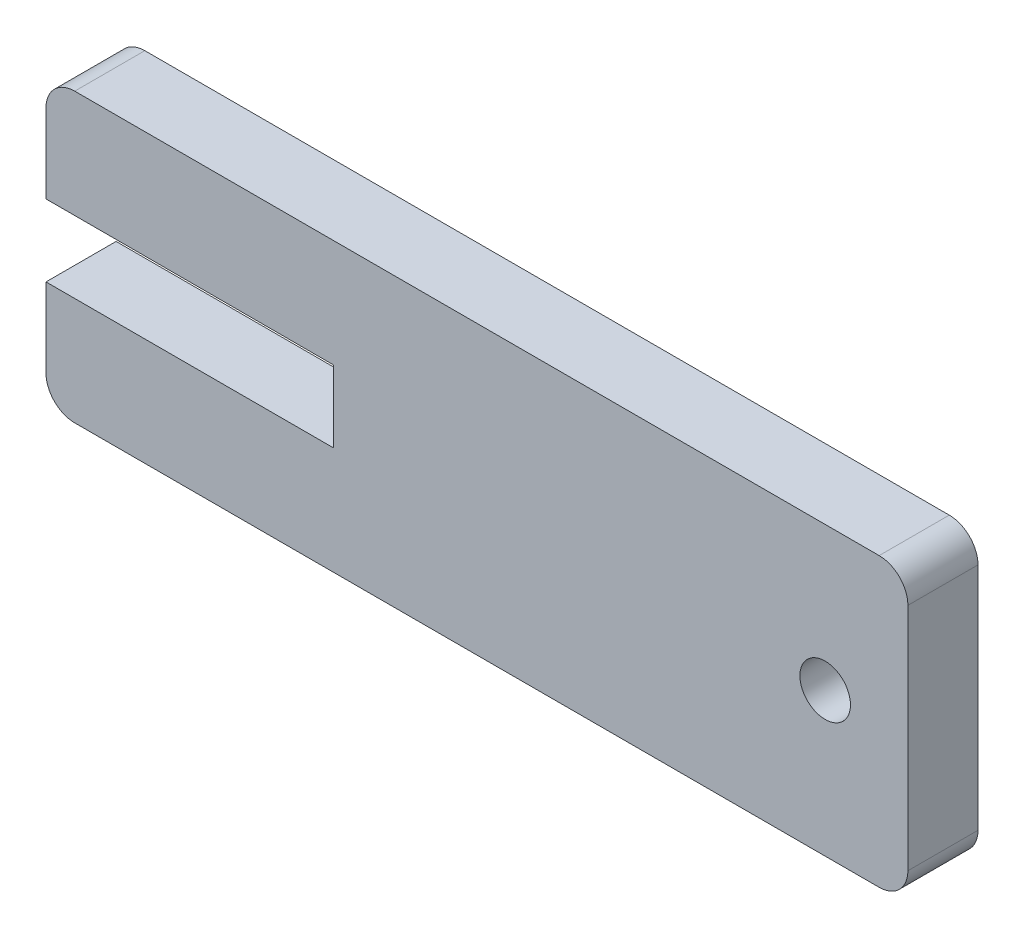
ISO-10303-21;
HEADER;
FILE_DESCRIPTION(('STEP AP214'),'2;1');
FILE_NAME('part.step','',(''),(''),'','','');
FILE_SCHEMA(('AUTOMOTIVE_DESIGN { 1 0 10303 214 1 1 1 1 }'));
ENDSEC;
DATA;
#1=APPLICATION_CONTEXT('core data for automotive mechanical design processes');
#2=APPLICATION_PROTOCOL_DEFINITION('international standard','automotive_design',2000,#1);
#3=PRODUCT_CONTEXT('',#1,'mechanical');
#4=PRODUCT('Part','Part','',(#3));
#5=PRODUCT_RELATED_PRODUCT_CATEGORY('part','',(#4));
#6=PRODUCT_DEFINITION_FORMATION('','',#4);
#7=PRODUCT_DEFINITION_CONTEXT('part definition',#1,'design');
#8=PRODUCT_DEFINITION('design','',#6,#7);
#9=PRODUCT_DEFINITION_SHAPE('','',#8);
#10=(LENGTH_UNIT() NAMED_UNIT(*) SI_UNIT(.MILLI.,.METRE.));
#11=(NAMED_UNIT(*) PLANE_ANGLE_UNIT() SI_UNIT($,.RADIAN.));
#12=(NAMED_UNIT(*) SI_UNIT($,.STERADIAN.) SOLID_ANGLE_UNIT());
#13=UNCERTAINTY_MEASURE_WITH_UNIT(LENGTH_MEASURE(1.E-05),#10,'distance_accuracy_value','');
#14=(GEOMETRIC_REPRESENTATION_CONTEXT(3) GLOBAL_UNCERTAINTY_ASSIGNED_CONTEXT((#13)) GLOBAL_UNIT_ASSIGNED_CONTEXT((#10,
#11,#12)) REPRESENTATION_CONTEXT('',''));
#15=CARTESIAN_POINT('',(0.,0.,0.));
#16=DIRECTION('',(0.,0.,1.));
#17=DIRECTION('',(1.,0.,0.));
#18=AXIS2_PLACEMENT_3D('',#15,#16,#17);
#19=CARTESIAN_POINT('',(0.,-1.5875,1.5494));
#20=DIRECTION('',(1.,0.,0.));
#21=DIRECTION('',(0.,0.,-1.));
#22=AXIS2_PLACEMENT_3D('',#19,#20,#21);
#23=PLANE('',#22);
#24=DIRECTION('',(0.,-1.,0.));
#25=VECTOR('',#24,1.);
#26=CARTESIAN_POINT('',(0.,-1.5875,-1.5494));
#27=LINE('',#26,#25);
#28=CARTESIAN_POINT('',(0.,1.5875,-1.5494));
#29=VERTEX_POINT('',#28);
#30=CARTESIAN_POINT('',(0.,-1.5875,-1.5494));
#31=VERTEX_POINT('',#30);
#32=EDGE_CURVE('E149',#29,#31,#27,.T.);
#33=ORIENTED_EDGE('',*,*,#32,.T.);
#34=DIRECTION('',(0.,0.,-1.));
#35=VECTOR('',#34,1.);
#36=CARTESIAN_POINT('',(0.,-1.5875,1.5494));
#37=LINE('',#36,#35);
#38=CARTESIAN_POINT('',(0.,-1.5875,1.5494));
#39=VERTEX_POINT('',#38);
#40=EDGE_CURVE('E130',#39,#31,#37,.T.);
#41=ORIENTED_EDGE('',*,*,#40,.F.);
#42=DIRECTION('',(0.,-1.,0.));
#43=VECTOR('',#42,1.);
#44=CARTESIAN_POINT('',(0.,-1.5875,1.5494));
#45=LINE('',#44,#43);
#46=CARTESIAN_POINT('',(0.,1.5875,1.5494));
#47=VERTEX_POINT('',#46);
#48=EDGE_CURVE('E137',#47,#39,#45,.T.);
#49=ORIENTED_EDGE('',*,*,#48,.F.);
#50=DIRECTION('',(0.,0.,-1.));
#51=VECTOR('',#50,1.);
#52=CARTESIAN_POINT('',(0.,1.5875,1.5494));
#53=LINE('',#52,#51);
#54=EDGE_CURVE('E205',#47,#29,#53,.T.);
#55=ORIENTED_EDGE('',*,*,#54,.T.);
#56=EDGE_LOOP('',(#33,#41,#49,#55));
#57=FACE_BOUND('',#56,.T.);
#58=ADVANCED_FACE('F35',(#57),#23,.F.);
#59=CARTESIAN_POINT('',(-12.7,-1.5875,1.5494));
#60=DIRECTION('',(0.,-1.,0.));
#61=DIRECTION('',(0.,0.,-1.));
#62=AXIS2_PLACEMENT_3D('',#59,#60,#61);
#63=PLANE('',#62);
#64=DIRECTION('',(-1.,0.,0.));
#65=VECTOR('',#64,1.);
#66=CARTESIAN_POINT('',(-12.7,-1.5875,-1.5494));
#67=LINE('',#66,#65);
#68=CARTESIAN_POINT('',(-12.7,-1.5875,-1.5494));
#69=VERTEX_POINT('',#68);
#70=EDGE_CURVE('E213',#31,#69,#67,.T.);
#71=ORIENTED_EDGE('',*,*,#70,.T.);
#72=DIRECTION('',(0.,0.,-1.));
#73=VECTOR('',#72,1.);
#74=CARTESIAN_POINT('',(-12.7,-1.5875,1.5494));
#75=LINE('',#74,#73);
#76=CARTESIAN_POINT('',(-12.7,-1.5875,1.5494));
#77=VERTEX_POINT('',#76);
#78=EDGE_CURVE('E133',#77,#69,#75,.T.);
#79=ORIENTED_EDGE('',*,*,#78,.F.);
#80=DIRECTION('',(-1.,0.,0.));
#81=VECTOR('',#80,1.);
#82=CARTESIAN_POINT('',(-12.7,-1.5875,1.5494));
#83=LINE('',#82,#81);
#84=EDGE_CURVE('E126',#39,#77,#83,.T.);
#85=ORIENTED_EDGE('',*,*,#84,.F.);
#86=ORIENTED_EDGE('',*,*,#40,.T.);
#87=EDGE_LOOP('',(#71,#79,#85,#86));
#88=FACE_BOUND('',#87,.T.);
#89=ADVANCED_FACE('F128',(#88),#63,.F.);
#90=CARTESIAN_POINT('',(-12.7,-1.5875,1.5494));
#91=DIRECTION('',(1.,0.,0.));
#92=DIRECTION('',(0.,0.,-1.));
#93=AXIS2_PLACEMENT_3D('',#90,#91,#92);
#94=PLANE('',#93);
#95=DIRECTION('',(0.,-1.,0.));
#96=VECTOR('',#95,1.);
#97=CARTESIAN_POINT('',(-12.7,-1.5875,-1.5494));
#98=LINE('',#97,#96);
#99=CARTESIAN_POINT('',(-12.7,-5.08,-1.5494));
#100=VERTEX_POINT('',#99);
#101=EDGE_CURVE('E216',#69,#100,#98,.T.);
#102=ORIENTED_EDGE('',*,*,#101,.T.);
#103=DIRECTION('',(0.,0.,-1.));
#104=VECTOR('',#103,1.);
#105=CARTESIAN_POINT('',(-12.7,-5.08,1.5494));
#106=LINE('',#105,#104);
#107=CARTESIAN_POINT('',(-12.7,-5.08,1.5494));
#108=VERTEX_POINT('',#107);
#109=EDGE_CURVE('E168',#100,#108,#106,.F.);
#110=ORIENTED_EDGE('',*,*,#109,.T.);
#111=DIRECTION('',(0.,-1.,0.));
#112=VECTOR('',#111,1.);
#113=CARTESIAN_POINT('',(-12.7,-1.5875,1.5494));
#114=LINE('',#113,#112);
#115=EDGE_CURVE('E136',#77,#108,#114,.T.);
#116=ORIENTED_EDGE('',*,*,#115,.F.);
#117=ORIENTED_EDGE('',*,*,#78,.T.);
#118=EDGE_LOOP('',(#102,#110,#116,#117));
#119=FACE_BOUND('',#118,.T.);
#120=ADVANCED_FACE('F265',(#119),#94,.F.);
#121=CARTESIAN_POINT('',(-12.7,-6.35,1.5494));
#122=DIRECTION('',(0.,1.,0.));
#123=DIRECTION('',(0.,0.,1.));
#124=AXIS2_PLACEMENT_3D('',#121,#122,#123);
#125=PLANE('',#124);
#126=DIRECTION('',(1.,0.,0.));
#127=VECTOR('',#126,1.);
#128=CARTESIAN_POINT('',(-12.7,-6.35,1.5494));
#129=LINE('',#128,#127);
#130=CARTESIAN_POINT('',(-11.43,-6.35,1.5494));
#131=VERTEX_POINT('',#130);
#132=CARTESIAN_POINT('',(24.13,-6.35,1.5494));
#133=VERTEX_POINT('',#132);
#134=EDGE_CURVE('E239',#131,#133,#129,.T.);
#135=ORIENTED_EDGE('',*,*,#134,.F.);
#136=DIRECTION('',(0.,0.,-1.));
#137=VECTOR('',#136,1.);
#138=CARTESIAN_POINT('',(-11.43,-6.35,1.5494));
#139=LINE('',#138,#137);
#140=CARTESIAN_POINT('',(-11.43,-6.35,-1.5494));
#141=VERTEX_POINT('',#140);
#142=EDGE_CURVE('E152',#131,#141,#139,.T.);
#143=ORIENTED_EDGE('',*,*,#142,.T.);
#144=DIRECTION('',(1.,0.,0.));
#145=VECTOR('',#144,1.);
#146=CARTESIAN_POINT('',(-12.7,-6.35,-1.5494));
#147=LINE('',#146,#145);
#148=CARTESIAN_POINT('',(24.13,-6.35,-1.5494));
#149=VERTEX_POINT('',#148);
#150=EDGE_CURVE('E200',#141,#149,#147,.T.);
#151=ORIENTED_EDGE('',*,*,#150,.T.);
#152=DIRECTION('',(0.,0.,-1.));
#153=VECTOR('',#152,1.);
#154=CARTESIAN_POINT('',(24.13,-6.35,1.5494));
#155=LINE('',#154,#153);
#156=EDGE_CURVE('E150',#149,#133,#155,.F.);
#157=ORIENTED_EDGE('',*,*,#156,.T.);
#158=EDGE_LOOP('',(#135,#143,#151,#157));
#159=FACE_BOUND('',#158,.T.);
#160=ADVANCED_FACE('F229',(#159),#125,.F.);
#161=CARTESIAN_POINT('',(25.4,6.35,1.5494));
#162=DIRECTION('',(-1.,0.,0.));
#163=DIRECTION('',(0.,0.,1.));
#164=AXIS2_PLACEMENT_3D('',#161,#162,#163);
#165=PLANE('',#164);
#166=DIRECTION('',(0.,1.,0.));
#167=VECTOR('',#166,1.);
#168=CARTESIAN_POINT('',(25.4,6.35,1.5494));
#169=LINE('',#168,#167);
#170=CARTESIAN_POINT('',(25.4,-5.08,1.5494));
#171=VERTEX_POINT('',#170);
#172=CARTESIAN_POINT('',(25.4,5.08,1.5494));
#173=VERTEX_POINT('',#172);
#174=EDGE_CURVE('E238',#171,#173,#169,.T.);
#175=ORIENTED_EDGE('',*,*,#174,.F.);
#176=DIRECTION('',(0.,0.,-1.));
#177=VECTOR('',#176,1.);
#178=CARTESIAN_POINT('',(25.4,-5.08,1.5494));
#179=LINE('',#178,#177);
#180=CARTESIAN_POINT('',(25.4,-5.08,-1.5494));
#181=VERTEX_POINT('',#180);
#182=EDGE_CURVE('E179',#171,#181,#179,.T.);
#183=ORIENTED_EDGE('',*,*,#182,.T.);
#184=DIRECTION('',(0.,1.,0.));
#185=VECTOR('',#184,1.);
#186=CARTESIAN_POINT('',(25.4,6.35,-1.5494));
#187=LINE('',#186,#185);
#188=CARTESIAN_POINT('',(25.4,5.08,-1.5494));
#189=VERTEX_POINT('',#188);
#190=EDGE_CURVE('E197',#181,#189,#187,.T.);
#191=ORIENTED_EDGE('',*,*,#190,.T.);
#192=DIRECTION('',(0.,0.,-1.));
#193=VECTOR('',#192,1.);
#194=CARTESIAN_POINT('',(25.4,5.08,1.5494));
#195=LINE('',#194,#193);
#196=EDGE_CURVE('E177',#189,#173,#195,.F.);
#197=ORIENTED_EDGE('',*,*,#196,.T.);
#198=EDGE_LOOP('',(#175,#183,#191,#197));
#199=FACE_BOUND('',#198,.T.);
#200=ADVANCED_FACE('F241',(#199),#165,.F.);
#201=CARTESIAN_POINT('',(-12.7,6.35,1.5494));
#202=DIRECTION('',(0.,-1.,0.));
#203=DIRECTION('',(0.,0.,-1.));
#204=AXIS2_PLACEMENT_3D('',#201,#202,#203);
#205=PLANE('',#204);
#206=DIRECTION('',(-1.,0.,0.));
#207=VECTOR('',#206,1.);
#208=CARTESIAN_POINT('',(-12.7,6.35,1.5494));
#209=LINE('',#208,#207);
#210=CARTESIAN_POINT('',(24.13,6.35,1.5494));
#211=VERTEX_POINT('',#210);
#212=CARTESIAN_POINT('',(-11.43,6.35,1.5494));
#213=VERTEX_POINT('',#212);
#214=EDGE_CURVE('E187',#211,#213,#209,.T.);
#215=ORIENTED_EDGE('',*,*,#214,.F.);
#216=DIRECTION('',(0.,0.,-1.));
#217=VECTOR('',#216,1.);
#218=CARTESIAN_POINT('',(24.13,6.35,1.5494));
#219=LINE('',#218,#217);
#220=CARTESIAN_POINT('',(24.13,6.35,-1.5494));
#221=VERTEX_POINT('',#220);
#222=EDGE_CURVE('E43',#211,#221,#219,.T.);
#223=ORIENTED_EDGE('',*,*,#222,.T.);
#224=DIRECTION('',(-1.,0.,0.));
#225=VECTOR('',#224,1.);
#226=CARTESIAN_POINT('',(-12.7,6.35,-1.5494));
#227=LINE('',#226,#225);
#228=CARTESIAN_POINT('',(-11.43,6.35,-1.5494));
#229=VERTEX_POINT('',#228);
#230=EDGE_CURVE('E186',#221,#229,#227,.T.);
#231=ORIENTED_EDGE('',*,*,#230,.T.);
#232=DIRECTION('',(0.,0.,-1.));
#233=VECTOR('',#232,1.);
#234=CARTESIAN_POINT('',(-11.43,6.35,1.5494));
#235=LINE('',#234,#233);
#236=EDGE_CURVE('E58',#229,#213,#235,.F.);
#237=ORIENTED_EDGE('',*,*,#236,.T.);
#238=EDGE_LOOP('',(#215,#223,#231,#237));
#239=FACE_BOUND('',#238,.T.);
#240=ADVANCED_FACE('F185',(#239),#205,.F.);
#241=CARTESIAN_POINT('',(-12.7,1.5875,1.5494));
#242=DIRECTION('',(1.,0.,0.));
#243=DIRECTION('',(0.,0.,-1.));
#244=AXIS2_PLACEMENT_3D('',#241,#242,#243);
#245=PLANE('',#244);
#246=DIRECTION('',(0.,-1.,0.));
#247=VECTOR('',#246,1.);
#248=CARTESIAN_POINT('',(-12.7,1.5875,1.5494));
#249=LINE('',#248,#247);
#250=CARTESIAN_POINT('',(-12.7,5.08,1.5494));
#251=VERTEX_POINT('',#250);
#252=CARTESIAN_POINT('',(-12.7,1.5875,1.5494));
#253=VERTEX_POINT('',#252);
#254=EDGE_CURVE('E244',#251,#253,#249,.T.);
#255=ORIENTED_EDGE('',*,*,#254,.F.);
#256=DIRECTION('',(0.,0.,-1.));
#257=VECTOR('',#256,1.);
#258=CARTESIAN_POINT('',(-12.7,5.08,1.5494));
#259=LINE('',#258,#257);
#260=CARTESIAN_POINT('',(-12.7,5.08,-1.5494));
#261=VERTEX_POINT('',#260);
#262=EDGE_CURVE('E11',#251,#261,#259,.T.);
#263=ORIENTED_EDGE('',*,*,#262,.T.);
#264=DIRECTION('',(0.,-1.,0.));
#265=VECTOR('',#264,1.);
#266=CARTESIAN_POINT('',(-12.7,1.5875,-1.5494));
#267=LINE('',#266,#265);
#268=CARTESIAN_POINT('',(-12.7,1.5875,-1.5494));
#269=VERTEX_POINT('',#268);
#270=EDGE_CURVE('E196',#261,#269,#267,.T.);
#271=ORIENTED_EDGE('',*,*,#270,.T.);
#272=DIRECTION('',(0.,0.,-1.));
#273=VECTOR('',#272,1.);
#274=CARTESIAN_POINT('',(-12.7,1.5875,1.5494));
#275=LINE('',#274,#273);
#276=EDGE_CURVE('E154',#253,#269,#275,.T.);
#277=ORIENTED_EDGE('',*,*,#276,.F.);
#278=EDGE_LOOP('',(#255,#263,#271,#277));
#279=FACE_BOUND('',#278,.T.);
#280=ADVANCED_FACE('F249',(#279),#245,.F.);
#281=CARTESIAN_POINT('',(-12.7,1.5875,1.5494));
#282=DIRECTION('',(0.,1.,0.));
#283=DIRECTION('',(0.,0.,1.));
#284=AXIS2_PLACEMENT_3D('',#281,#282,#283);
#285=PLANE('',#284);
#286=DIRECTION('',(1.,0.,0.));
#287=VECTOR('',#286,1.);
#288=CARTESIAN_POINT('',(-12.7,1.5875,-1.5494));
#289=LINE('',#288,#287);
#290=EDGE_CURVE('E146',#269,#29,#289,.T.);
#291=ORIENTED_EDGE('',*,*,#290,.T.);
#292=ORIENTED_EDGE('',*,*,#54,.F.);
#293=DIRECTION('',(1.,0.,0.));
#294=VECTOR('',#293,1.);
#295=CARTESIAN_POINT('',(-12.7,1.5875,1.5494));
#296=LINE('',#295,#294);
#297=EDGE_CURVE('E142',#253,#47,#296,.T.);
#298=ORIENTED_EDGE('',*,*,#297,.F.);
#299=ORIENTED_EDGE('',*,*,#276,.T.);
#300=EDGE_LOOP('',(#291,#292,#298,#299));
#301=FACE_BOUND('',#300,.T.);
#302=ADVANCED_FACE('F210',(#301),#285,.F.);
#303=CARTESIAN_POINT('',(0.,0.,1.5494));
#304=DIRECTION('',(0.,0.,-1.));
#305=DIRECTION('',(-1.,0.,0.));
#306=AXIS2_PLACEMENT_3D('',#303,#304,#305);
#307=PLANE('',#306);
#308=CARTESIAN_POINT('',(21.7424,0.,1.5494));
#309=DIRECTION('',(0.,0.,1.));
#310=DIRECTION('',(1.,0.,0.));
#311=AXIS2_PLACEMENT_3D('',#308,#309,#310);
#312=CIRCLE('',#311,1.1176);
#313=CARTESIAN_POINT('',(22.86,0.,1.5494));
#314=VERTEX_POINT('',#313);
#315=EDGE_CURVE('E219',#314,#314,#312,.T.);
#316=ORIENTED_EDGE('',*,*,#315,.F.);
#317=EDGE_LOOP('',(#316));
#318=FACE_BOUND('',#317,.T.);
#319=ORIENTED_EDGE('',*,*,#115,.T.);
#320=CARTESIAN_POINT('',(-11.43,-5.08,1.5494));
#321=DIRECTION('',(0.,0.,-1.));
#322=DIRECTION('',(-1.,0.,0.));
#323=AXIS2_PLACEMENT_3D('',#320,#321,#322);
#324=CIRCLE('',#323,1.27);
#325=EDGE_CURVE('E175',#108,#131,#324,.F.);
#326=ORIENTED_EDGE('',*,*,#325,.T.);
#327=ORIENTED_EDGE('',*,*,#134,.T.);
#328=CARTESIAN_POINT('',(24.13,-5.08,1.5494));
#329=DIRECTION('',(0.,0.,-1.));
#330=DIRECTION('',(-1.,0.,0.));
#331=AXIS2_PLACEMENT_3D('',#328,#329,#330);
#332=CIRCLE('',#331,1.27);
#333=EDGE_CURVE('E173',#133,#171,#332,.F.);
#334=ORIENTED_EDGE('',*,*,#333,.T.);
#335=ORIENTED_EDGE('',*,*,#174,.T.);
#336=CARTESIAN_POINT('',(24.13,5.08,1.5494));
#337=DIRECTION('',(0.,0.,-1.));
#338=DIRECTION('',(-1.,0.,0.));
#339=AXIS2_PLACEMENT_3D('',#336,#337,#338);
#340=CIRCLE('',#339,1.27);
#341=EDGE_CURVE('E171',#173,#211,#340,.F.);
#342=ORIENTED_EDGE('',*,*,#341,.T.);
#343=ORIENTED_EDGE('',*,*,#214,.T.);
#344=CARTESIAN_POINT('',(-11.43,5.08,1.5494));
#345=DIRECTION('',(0.,0.,-1.));
#346=DIRECTION('',(-1.,0.,0.));
#347=AXIS2_PLACEMENT_3D('',#344,#345,#346);
#348=CIRCLE('',#347,1.27);
#349=EDGE_CURVE('E50',#213,#251,#348,.F.);
#350=ORIENTED_EDGE('',*,*,#349,.T.);
#351=ORIENTED_EDGE('',*,*,#254,.T.);
#352=ORIENTED_EDGE('',*,*,#297,.T.);
#353=ORIENTED_EDGE('',*,*,#48,.T.);
#354=ORIENTED_EDGE('',*,*,#84,.T.);
#355=EDGE_LOOP('',(#319,#326,#327,#334,#335,#342,#343,#350,#351,#352,#353,#354));
#356=FACE_BOUND('',#355,.T.);
#357=ADVANCED_FACE('F140',(#318,#356),#307,.F.);
#358=CARTESIAN_POINT('',(0.,0.,-1.5494));
#359=DIRECTION('',(0.,0.,-1.));
#360=DIRECTION('',(-1.,0.,0.));
#361=AXIS2_PLACEMENT_3D('',#358,#359,#360);
#362=PLANE('',#361);
#363=CARTESIAN_POINT('',(21.7424,0.,-1.5494));
#364=DIRECTION('',(0.,0.,1.));
#365=DIRECTION('',(1.,0.,0.));
#366=AXIS2_PLACEMENT_3D('',#363,#364,#365);
#367=CIRCLE('',#366,1.1176);
#368=CARTESIAN_POINT('',(22.86,0.,-1.5494));
#369=VERTEX_POINT('',#368);
#370=EDGE_CURVE('E214',#369,#369,#367,.T.);
#371=ORIENTED_EDGE('',*,*,#370,.T.);
#372=EDGE_LOOP('',(#371));
#373=FACE_BOUND('',#372,.T.);
#374=ORIENTED_EDGE('',*,*,#150,.F.);
#375=CARTESIAN_POINT('',(-11.43,-5.08,-1.5494));
#376=DIRECTION('',(0.,0.,-1.));
#377=DIRECTION('',(-1.,0.,0.));
#378=AXIS2_PLACEMENT_3D('',#375,#376,#377);
#379=CIRCLE('',#378,1.27);
#380=EDGE_CURVE('E166',#141,#100,#379,.T.);
#381=ORIENTED_EDGE('',*,*,#380,.T.);
#382=ORIENTED_EDGE('',*,*,#101,.F.);
#383=ORIENTED_EDGE('',*,*,#70,.F.);
#384=ORIENTED_EDGE('',*,*,#32,.F.);
#385=ORIENTED_EDGE('',*,*,#290,.F.);
#386=ORIENTED_EDGE('',*,*,#270,.F.);
#387=CARTESIAN_POINT('',(-11.43,5.08,-1.5494));
#388=DIRECTION('',(0.,0.,-1.));
#389=DIRECTION('',(-1.,0.,0.));
#390=AXIS2_PLACEMENT_3D('',#387,#388,#389);
#391=CIRCLE('',#390,1.27);
#392=EDGE_CURVE('E160',#261,#229,#391,.T.);
#393=ORIENTED_EDGE('',*,*,#392,.T.);
#394=ORIENTED_EDGE('',*,*,#230,.F.);
#395=CARTESIAN_POINT('',(24.13,5.08,-1.5494));
#396=DIRECTION('',(0.,0.,-1.));
#397=DIRECTION('',(-1.,0.,0.));
#398=AXIS2_PLACEMENT_3D('',#395,#396,#397);
#399=CIRCLE('',#398,1.27);
#400=EDGE_CURVE('E162',#221,#189,#399,.T.);
#401=ORIENTED_EDGE('',*,*,#400,.T.);
#402=ORIENTED_EDGE('',*,*,#190,.F.);
#403=CARTESIAN_POINT('',(24.13,-5.08,-1.5494));
#404=DIRECTION('',(0.,0.,-1.));
#405=DIRECTION('',(-1.,0.,0.));
#406=AXIS2_PLACEMENT_3D('',#403,#404,#405);
#407=CIRCLE('',#406,1.27);
#408=EDGE_CURVE('E164',#181,#149,#407,.T.);
#409=ORIENTED_EDGE('',*,*,#408,.T.);
#410=EDGE_LOOP('',(#374,#381,#382,#383,#384,#385,#386,#393,#394,#401,#402,#409));
#411=FACE_BOUND('',#410,.T.);
#412=ADVANCED_FACE('F192',(#373,#411),#362,.T.);
#413=CARTESIAN_POINT('',(-11.43,-5.08,1.5494));
#414=DIRECTION('',(0.,0.,-1.));
#415=DIRECTION('',(-1.,0.,0.));
#416=AXIS2_PLACEMENT_3D('',#413,#414,#415);
#417=CYLINDRICAL_SURFACE('',#416,1.27);
#418=ORIENTED_EDGE('',*,*,#325,.F.);
#419=ORIENTED_EDGE('',*,*,#109,.F.);
#420=ORIENTED_EDGE('',*,*,#380,.F.);
#421=ORIENTED_EDGE('',*,*,#142,.F.);
#422=EDGE_LOOP('',(#418,#419,#420,#421));
#423=FACE_BOUND('',#422,.T.);
#424=ADVANCED_FACE('F269',(#423),#417,.T.);
#425=CARTESIAN_POINT('',(24.13,-5.08,1.5494));
#426=DIRECTION('',(0.,0.,-1.));
#427=DIRECTION('',(-1.,0.,0.));
#428=AXIS2_PLACEMENT_3D('',#425,#426,#427);
#429=CYLINDRICAL_SURFACE('',#428,1.27);
#430=ORIENTED_EDGE('',*,*,#333,.F.);
#431=ORIENTED_EDGE('',*,*,#156,.F.);
#432=ORIENTED_EDGE('',*,*,#408,.F.);
#433=ORIENTED_EDGE('',*,*,#182,.F.);
#434=EDGE_LOOP('',(#430,#431,#432,#433));
#435=FACE_BOUND('',#434,.T.);
#436=ADVANCED_FACE('F234',(#435),#429,.T.);
#437=CARTESIAN_POINT('',(24.13,5.08,1.5494));
#438=DIRECTION('',(0.,0.,-1.));
#439=DIRECTION('',(-1.,0.,0.));
#440=AXIS2_PLACEMENT_3D('',#437,#438,#439);
#441=CYLINDRICAL_SURFACE('',#440,1.27);
#442=ORIENTED_EDGE('',*,*,#341,.F.);
#443=ORIENTED_EDGE('',*,*,#196,.F.);
#444=ORIENTED_EDGE('',*,*,#400,.F.);
#445=ORIENTED_EDGE('',*,*,#222,.F.);
#446=EDGE_LOOP('',(#442,#443,#444,#445));
#447=FACE_BOUND('',#446,.T.);
#448=ADVANCED_FACE('F253',(#447),#441,.T.);
#449=CARTESIAN_POINT('',(-11.43,5.08,1.5494));
#450=DIRECTION('',(0.,0.,-1.));
#451=DIRECTION('',(-1.,0.,0.));
#452=AXIS2_PLACEMENT_3D('',#449,#450,#451);
#453=CYLINDRICAL_SURFACE('',#452,1.27);
#454=ORIENTED_EDGE('',*,*,#349,.F.);
#455=ORIENTED_EDGE('',*,*,#236,.F.);
#456=ORIENTED_EDGE('',*,*,#392,.F.);
#457=ORIENTED_EDGE('',*,*,#262,.F.);
#458=EDGE_LOOP('',(#454,#455,#456,#457));
#459=FACE_BOUND('',#458,.T.);
#460=ADVANCED_FACE('F37',(#459),#453,.T.);
#461=CARTESIAN_POINT('',(21.7424,0.,-1.5494));
#462=DIRECTION('',(0.,0.,1.));
#463=DIRECTION('',(1.,0.,0.));
#464=AXIS2_PLACEMENT_3D('',#461,#462,#463);
#465=CYLINDRICAL_SURFACE('',#464,1.1176);
#466=ORIENTED_EDGE('',*,*,#370,.F.);
#467=EDGE_LOOP('',(#466));
#468=FACE_BOUND('',#467,.T.);
#469=ORIENTED_EDGE('',*,*,#315,.T.);
#470=EDGE_LOOP('',(#469));
#471=FACE_BOUND('',#470,.T.);
#472=ADVANCED_FACE('F252',(#468,#471),#465,.F.);
#473=CLOSED_SHELL('',(#58,#89,#120,#160,#200,#240,#280,#302,#357,#412,#424,#436,#448,#460,#472));
#474=MANIFOLD_SOLID_BREP('B2',#473);
#475=ADVANCED_BREP_SHAPE_REPRESENTATION('',(#18,#474),#14);
#476=SHAPE_DEFINITION_REPRESENTATION(#9,#475);
ENDSEC;
END-ISO-10303-21;
